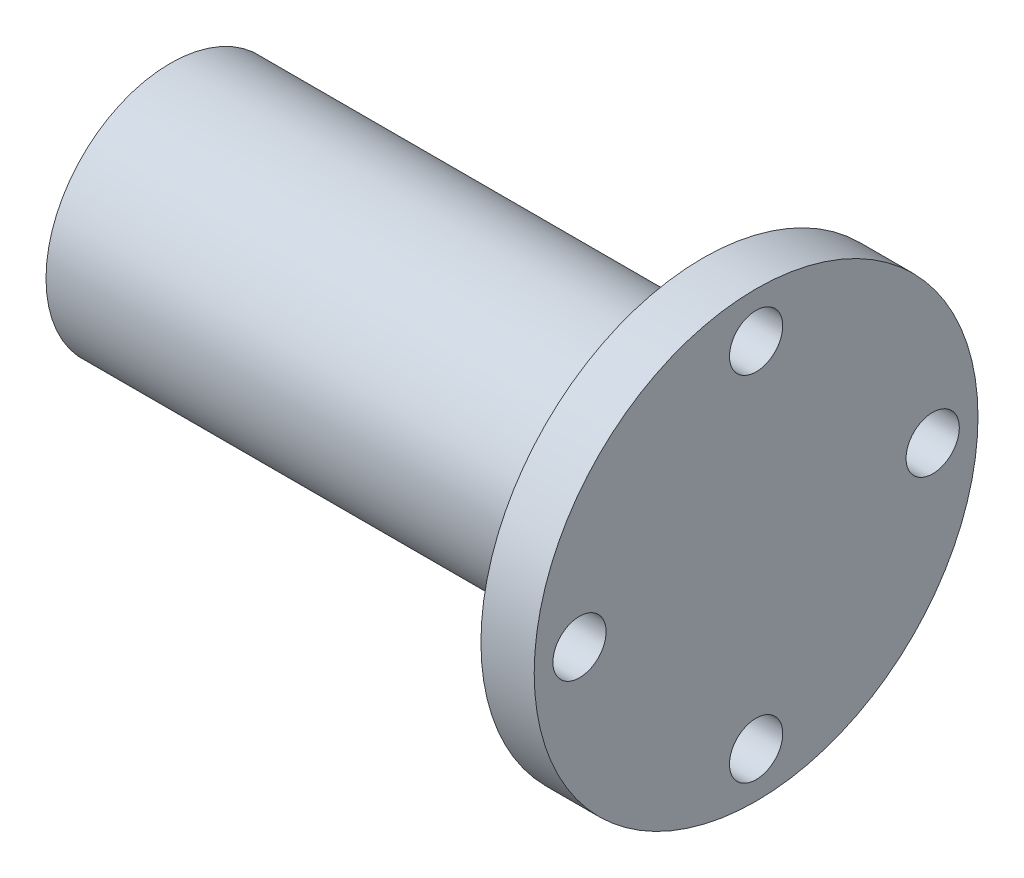
ISO-10303-21;
HEADER;
FILE_DESCRIPTION(('STEP AP214'),'2;1');
FILE_NAME('part.step','',(''),(''),'','','');
FILE_SCHEMA(('AUTOMOTIVE_DESIGN { 1 0 10303 214 1 1 1 1 }'));
ENDSEC;
DATA;
#1=APPLICATION_CONTEXT('core data for automotive mechanical design processes');
#2=APPLICATION_PROTOCOL_DEFINITION('international standard','automotive_design',2000,#1);
#3=PRODUCT_CONTEXT('',#1,'mechanical');
#4=PRODUCT('Part','Part','',(#3));
#5=PRODUCT_RELATED_PRODUCT_CATEGORY('part','',(#4));
#6=PRODUCT_DEFINITION_FORMATION('','',#4);
#7=PRODUCT_DEFINITION_CONTEXT('part definition',#1,'design');
#8=PRODUCT_DEFINITION('design','',#6,#7);
#9=PRODUCT_DEFINITION_SHAPE('','',#8);
#10=(LENGTH_UNIT() NAMED_UNIT(*) SI_UNIT(.MILLI.,.METRE.));
#11=(NAMED_UNIT(*) PLANE_ANGLE_UNIT() SI_UNIT($,.RADIAN.));
#12=(NAMED_UNIT(*) SI_UNIT($,.STERADIAN.) SOLID_ANGLE_UNIT());
#13=UNCERTAINTY_MEASURE_WITH_UNIT(LENGTH_MEASURE(1.E-05),#10,'distance_accuracy_value','');
#14=(GEOMETRIC_REPRESENTATION_CONTEXT(3) GLOBAL_UNCERTAINTY_ASSIGNED_CONTEXT((#13)) GLOBAL_UNIT_ASSIGNED_CONTEXT((#10,
#11,#12)) REPRESENTATION_CONTEXT('',''));
#15=CARTESIAN_POINT('',(0.,0.,0.));
#16=DIRECTION('',(0.,0.,1.));
#17=DIRECTION('',(1.,0.,0.));
#18=AXIS2_PLACEMENT_3D('',#15,#16,#17);
#19=CARTESIAN_POINT('',(-30.,0.,0.));
#20=DIRECTION('',(1.,0.,0.));
#21=DIRECTION('',(0.,0.,-1.));
#22=AXIS2_PLACEMENT_3D('',#19,#20,#21);
#23=CYLINDRICAL_SURFACE('',#22,7.);
#24=CARTESIAN_POINT('',(-30.,0.,0.));
#25=DIRECTION('',(1.,0.,0.));
#26=DIRECTION('',(0.,0.,-1.));
#27=AXIS2_PLACEMENT_3D('',#24,#25,#26);
#28=CIRCLE('',#27,7.);
#29=CARTESIAN_POINT('',(-30.,0.,-7.));
#30=VERTEX_POINT('',#29);
#31=EDGE_CURVE('E10',#30,#30,#28,.T.);
#32=ORIENTED_EDGE('',*,*,#31,.T.);
#33=EDGE_LOOP('',(#32));
#34=FACE_BOUND('',#33,.T.);
#35=CARTESIAN_POINT('',(0.,0.,0.));
#36=DIRECTION('',(1.,0.,0.));
#37=DIRECTION('',(0.,0.,-1.));
#38=AXIS2_PLACEMENT_3D('',#35,#36,#37);
#39=CIRCLE('',#38,7.);
#40=CARTESIAN_POINT('',(0.,0.,-7.));
#41=VERTEX_POINT('',#40);
#42=EDGE_CURVE('E37',#41,#41,#39,.T.);
#43=ORIENTED_EDGE('',*,*,#42,.F.);
#44=EDGE_LOOP('',(#43));
#45=FACE_BOUND('',#44,.T.);
#46=ADVANCED_FACE('F40',(#34,#45),#23,.T.);
#47=CARTESIAN_POINT('',(-30.,0.,0.));
#48=DIRECTION('',(1.,0.,0.));
#49=DIRECTION('',(0.,0.,-1.));
#50=AXIS2_PLACEMENT_3D('',#47,#48,#49);
#51=PLANE('',#50);
#52=ORIENTED_EDGE('',*,*,#31,.F.);
#53=EDGE_LOOP('',(#52));
#54=FACE_BOUND('',#53,.T.);
#55=ADVANCED_FACE('F84',(#54),#51,.F.);
#56=CARTESIAN_POINT('',(3.,0.,0.));
#57=DIRECTION('',(1.,0.,0.));
#58=DIRECTION('',(0.,0.,-1.));
#59=AXIS2_PLACEMENT_3D('',#56,#57,#58);
#60=PLANE('',#59);
#61=CARTESIAN_POINT('',(3.,-9.94711279007026,0.));
#62=DIRECTION('',(1.,0.,0.));
#63=DIRECTION('',(0.,0.,-1.));
#64=AXIS2_PLACEMENT_3D('',#61,#62,#63);
#65=CIRCLE('',#64,1.5);
#66=CARTESIAN_POINT('',(3.,-9.94711279007026,-1.5));
#67=VERTEX_POINT('',#66);
#68=EDGE_CURVE('E61',#67,#67,#65,.T.);
#69=ORIENTED_EDGE('',*,*,#68,.F.);
#70=EDGE_LOOP('',(#69));
#71=FACE_BOUND('',#70,.T.);
#72=CARTESIAN_POINT('',(3.,9.94711279007026,0.));
#73=DIRECTION('',(1.,0.,0.));
#74=DIRECTION('',(0.,0.,-1.));
#75=AXIS2_PLACEMENT_3D('',#72,#73,#74);
#76=CIRCLE('',#75,1.5);
#77=CARTESIAN_POINT('',(3.,9.94711279007026,-1.5));
#78=VERTEX_POINT('',#77);
#79=EDGE_CURVE('E55',#78,#78,#76,.T.);
#80=ORIENTED_EDGE('',*,*,#79,.F.);
#81=EDGE_LOOP('',(#80));
#82=FACE_BOUND('',#81,.T.);
#83=CARTESIAN_POINT('',(3.,0.,0.));
#84=DIRECTION('',(1.,0.,0.));
#85=DIRECTION('',(0.,0.,-1.));
#86=AXIS2_PLACEMENT_3D('',#83,#84,#85);
#87=CIRCLE('',#86,12.5);
#88=CARTESIAN_POINT('',(3.,0.,-12.5));
#89=VERTEX_POINT('',#88);
#90=EDGE_CURVE('E50',#89,#89,#87,.T.);
#91=ORIENTED_EDGE('',*,*,#90,.T.);
#92=EDGE_LOOP('',(#91));
#93=FACE_BOUND('',#92,.T.);
#94=CARTESIAN_POINT('',(3.,0.,-9.94711279007026));
#95=DIRECTION('',(1.,0.,0.));
#96=DIRECTION('',(0.,0.,-1.));
#97=AXIS2_PLACEMENT_3D('',#94,#95,#96);
#98=CIRCLE('',#97,1.5);
#99=CARTESIAN_POINT('',(3.,0.,-11.4471127900703));
#100=VERTEX_POINT('',#99);
#101=EDGE_CURVE('E59',#100,#100,#98,.T.);
#102=ORIENTED_EDGE('',*,*,#101,.F.);
#103=EDGE_LOOP('',(#102));
#104=FACE_BOUND('',#103,.T.);
#105=CARTESIAN_POINT('',(3.,0.,9.94711279007015));
#106=DIRECTION('',(1.,0.,0.));
#107=DIRECTION('',(0.,0.,-1.));
#108=AXIS2_PLACEMENT_3D('',#105,#106,#107);
#109=CIRCLE('',#108,1.5);
#110=CARTESIAN_POINT('',(3.,0.,8.44711279007015));
#111=VERTEX_POINT('',#110);
#112=EDGE_CURVE('E69',#111,#111,#109,.T.);
#113=ORIENTED_EDGE('',*,*,#112,.F.);
#114=EDGE_LOOP('',(#113));
#115=FACE_BOUND('',#114,.T.);
#116=ADVANCED_FACE('F85',(#71,#82,#93,#104,#115),#60,.T.);
#117=CARTESIAN_POINT('',(0.,0.,0.));
#118=DIRECTION('',(1.,0.,0.));
#119=DIRECTION('',(0.,0.,-1.));
#120=AXIS2_PLACEMENT_3D('',#117,#118,#119);
#121=PLANE('',#120);
#122=ORIENTED_EDGE('',*,*,#42,.T.);
#123=EDGE_LOOP('',(#122));
#124=FACE_BOUND('',#123,.T.);
#125=CARTESIAN_POINT('',(0.,0.,0.));
#126=DIRECTION('',(1.,0.,0.));
#127=DIRECTION('',(0.,0.,-1.));
#128=AXIS2_PLACEMENT_3D('',#125,#126,#127);
#129=CIRCLE('',#128,12.5);
#130=CARTESIAN_POINT('',(0.,0.,-12.5));
#131=VERTEX_POINT('',#130);
#132=EDGE_CURVE('E47',#131,#131,#129,.T.);
#133=ORIENTED_EDGE('',*,*,#132,.F.);
#134=EDGE_LOOP('',(#133));
#135=FACE_BOUND('',#134,.T.);
#136=CARTESIAN_POINT('',(0.,9.94711279007026,0.));
#137=DIRECTION('',(1.,0.,0.));
#138=DIRECTION('',(0.,0.,-1.));
#139=AXIS2_PLACEMENT_3D('',#136,#137,#138);
#140=CIRCLE('',#139,1.5);
#141=CARTESIAN_POINT('',(0.,9.94711279007026,-1.5));
#142=VERTEX_POINT('',#141);
#143=EDGE_CURVE('E54',#142,#142,#140,.T.);
#144=ORIENTED_EDGE('',*,*,#143,.T.);
#145=EDGE_LOOP('',(#144));
#146=FACE_BOUND('',#145,.T.);
#147=CARTESIAN_POINT('',(0.,0.,-9.94711279007026));
#148=DIRECTION('',(1.,0.,0.));
#149=DIRECTION('',(0.,0.,-1.));
#150=AXIS2_PLACEMENT_3D('',#147,#148,#149);
#151=CIRCLE('',#150,1.5);
#152=CARTESIAN_POINT('',(0.,0.,-11.4471127900703));
#153=VERTEX_POINT('',#152);
#154=EDGE_CURVE('E62',#153,#153,#151,.T.);
#155=ORIENTED_EDGE('',*,*,#154,.T.);
#156=EDGE_LOOP('',(#155));
#157=FACE_BOUND('',#156,.T.);
#158=CARTESIAN_POINT('',(0.,-9.94711279007026,0.));
#159=DIRECTION('',(1.,0.,0.));
#160=DIRECTION('',(0.,0.,-1.));
#161=AXIS2_PLACEMENT_3D('',#158,#159,#160);
#162=CIRCLE('',#161,1.5);
#163=CARTESIAN_POINT('',(0.,-9.94711279007026,-1.5));
#164=VERTEX_POINT('',#163);
#165=EDGE_CURVE('E70',#164,#164,#162,.T.);
#166=ORIENTED_EDGE('',*,*,#165,.T.);
#167=EDGE_LOOP('',(#166));
#168=FACE_BOUND('',#167,.T.);
#169=CARTESIAN_POINT('',(0.,0.,9.94711279007015));
#170=DIRECTION('',(1.,0.,0.));
#171=DIRECTION('',(0.,0.,-1.));
#172=AXIS2_PLACEMENT_3D('',#169,#170,#171);
#173=CIRCLE('',#172,1.5);
#174=CARTESIAN_POINT('',(0.,0.,8.44711279007015));
#175=VERTEX_POINT('',#174);
#176=EDGE_CURVE('E71',#175,#175,#173,.T.);
#177=ORIENTED_EDGE('',*,*,#176,.T.);
#178=EDGE_LOOP('',(#177));
#179=FACE_BOUND('',#178,.T.);
#180=ADVANCED_FACE('F82',(#124,#135,#146,#157,#168,#179),#121,.F.);
#181=CARTESIAN_POINT('',(3.,0.,0.));
#182=DIRECTION('',(-1.,0.,0.));
#183=DIRECTION('',(0.,0.,1.));
#184=AXIS2_PLACEMENT_3D('',#181,#182,#183);
#185=CYLINDRICAL_SURFACE('',#184,12.5);
#186=ORIENTED_EDGE('',*,*,#90,.F.);
#187=EDGE_LOOP('',(#186));
#188=FACE_BOUND('',#187,.T.);
#189=ORIENTED_EDGE('',*,*,#132,.T.);
#190=EDGE_LOOP('',(#189));
#191=FACE_BOUND('',#190,.T.);
#192=ADVANCED_FACE('F95',(#188,#191),#185,.T.);
#193=CARTESIAN_POINT('',(3.,9.94711279007026,0.));
#194=DIRECTION('',(-1.,0.,0.));
#195=DIRECTION('',(0.,0.,1.));
#196=AXIS2_PLACEMENT_3D('',#193,#194,#195);
#197=CYLINDRICAL_SURFACE('',#196,1.5);
#198=ORIENTED_EDGE('',*,*,#79,.T.);
#199=EDGE_LOOP('',(#198));
#200=FACE_BOUND('',#199,.T.);
#201=ORIENTED_EDGE('',*,*,#143,.F.);
#202=EDGE_LOOP('',(#201));
#203=FACE_BOUND('',#202,.T.);
#204=ADVANCED_FACE('F124',(#200,#203),#197,.F.);
#205=CARTESIAN_POINT('',(3.,0.,-9.94711279007026));
#206=DIRECTION('',(-1.,0.,0.));
#207=DIRECTION('',(0.,0.,1.));
#208=AXIS2_PLACEMENT_3D('',#205,#206,#207);
#209=CYLINDRICAL_SURFACE('',#208,1.5);
#210=ORIENTED_EDGE('',*,*,#101,.T.);
#211=EDGE_LOOP('',(#210));
#212=FACE_BOUND('',#211,.T.);
#213=ORIENTED_EDGE('',*,*,#154,.F.);
#214=EDGE_LOOP('',(#213));
#215=FACE_BOUND('',#214,.T.);
#216=ADVANCED_FACE('F118',(#212,#215),#209,.F.);
#217=CARTESIAN_POINT('',(3.,-9.94711279007026,0.));
#218=DIRECTION('',(-1.,0.,0.));
#219=DIRECTION('',(0.,0.,1.));
#220=AXIS2_PLACEMENT_3D('',#217,#218,#219);
#221=CYLINDRICAL_SURFACE('',#220,1.5);
#222=ORIENTED_EDGE('',*,*,#68,.T.);
#223=EDGE_LOOP('',(#222));
#224=FACE_BOUND('',#223,.T.);
#225=ORIENTED_EDGE('',*,*,#165,.F.);
#226=EDGE_LOOP('',(#225));
#227=FACE_BOUND('',#226,.T.);
#228=ADVANCED_FACE('F113',(#224,#227),#221,.F.);
#229=CARTESIAN_POINT('',(3.,0.,9.94711279007015));
#230=DIRECTION('',(-1.,0.,0.));
#231=DIRECTION('',(0.,0.,1.));
#232=AXIS2_PLACEMENT_3D('',#229,#230,#231);
#233=CYLINDRICAL_SURFACE('',#232,1.5);
#234=ORIENTED_EDGE('',*,*,#112,.T.);
#235=EDGE_LOOP('',(#234));
#236=FACE_BOUND('',#235,.T.);
#237=ORIENTED_EDGE('',*,*,#176,.F.);
#238=EDGE_LOOP('',(#237));
#239=FACE_BOUND('',#238,.T.);
#240=ADVANCED_FACE('F76',(#236,#239),#233,.F.);
#241=CLOSED_SHELL('',(#46,#55,#116,#180,#192,#204,#216,#228,#240));
#242=MANIFOLD_SOLID_BREP('B2',#241);
#243=ADVANCED_BREP_SHAPE_REPRESENTATION('',(#18,#242),#14);
#244=SHAPE_DEFINITION_REPRESENTATION(#9,#243);
ENDSEC;
END-ISO-10303-21;
